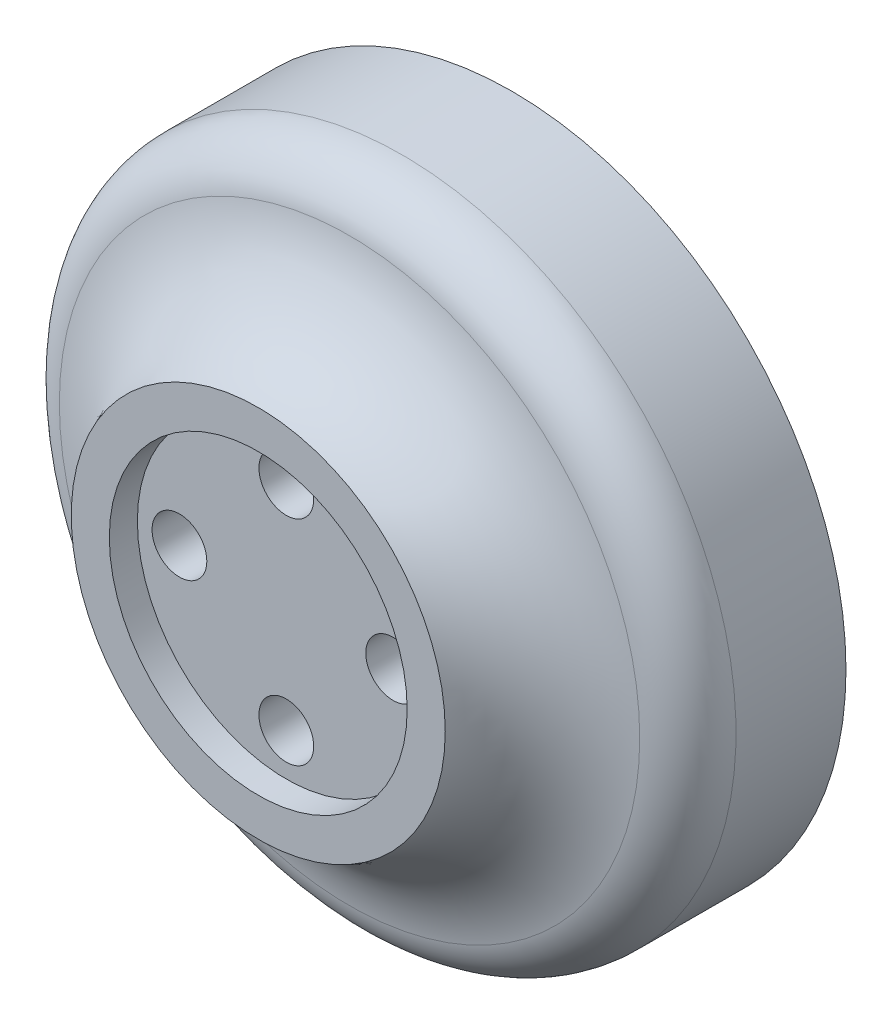
ISO-10303-21;
HEADER;
FILE_DESCRIPTION(('STEP AP214'),'2;1');
FILE_NAME('part.step','',(''),(''),'','','');
FILE_SCHEMA(('AUTOMOTIVE_DESIGN { 1 0 10303 214 1 1 1 1 }'));
ENDSEC;
DATA;
#1=APPLICATION_CONTEXT('core data for automotive mechanical design processes');
#2=APPLICATION_PROTOCOL_DEFINITION('international standard','automotive_design',2000,#1);
#3=PRODUCT_CONTEXT('',#1,'mechanical');
#4=PRODUCT('Part','Part','',(#3));
#5=PRODUCT_RELATED_PRODUCT_CATEGORY('part','',(#4));
#6=PRODUCT_DEFINITION_FORMATION('','',#4);
#7=PRODUCT_DEFINITION_CONTEXT('part definition',#1,'design');
#8=PRODUCT_DEFINITION('design','',#6,#7);
#9=PRODUCT_DEFINITION_SHAPE('','',#8);
#10=(LENGTH_UNIT() NAMED_UNIT(*) SI_UNIT(.MILLI.,.METRE.));
#11=(NAMED_UNIT(*) PLANE_ANGLE_UNIT() SI_UNIT($,.RADIAN.));
#12=(NAMED_UNIT(*) SI_UNIT($,.STERADIAN.) SOLID_ANGLE_UNIT());
#13=UNCERTAINTY_MEASURE_WITH_UNIT(LENGTH_MEASURE(1.E-05),#10,'distance_accuracy_value','');
#14=(GEOMETRIC_REPRESENTATION_CONTEXT(3) GLOBAL_UNCERTAINTY_ASSIGNED_CONTEXT((#13)) GLOBAL_UNIT_ASSIGNED_CONTEXT((#10,
#11,#12)) REPRESENTATION_CONTEXT('',''));
#15=CARTESIAN_POINT('',(0.,0.,0.));
#16=DIRECTION('',(0.,0.,1.));
#17=DIRECTION('',(1.,0.,0.));
#18=AXIS2_PLACEMENT_3D('',#15,#16,#17);
#19=CARTESIAN_POINT('',(0.,0.,12.));
#20=DIRECTION('',(0.,0.,-1.));
#21=DIRECTION('',(-1.,0.,0.));
#22=AXIS2_PLACEMENT_3D('',#19,#20,#21);
#23=CYLINDRICAL_SURFACE('',#22,25.);
#24=CARTESIAN_POINT('',(0.,0.,8.23223009349835));
#25=DIRECTION('',(0.,0.,-1.));
#26=DIRECTION('',(-1.,0.,0.));
#27=AXIS2_PLACEMENT_3D('',#24,#25,#26);
#28=CIRCLE('',#27,25.);
#29=CARTESIAN_POINT('',(-25.,0.,8.23223009349835));
#30=VERTEX_POINT('',#29);
#31=EDGE_CURVE('E10',#30,#30,#28,.T.);
#32=ORIENTED_EDGE('',*,*,#31,.T.);
#33=EDGE_LOOP('',(#32));
#34=FACE_BOUND('',#33,.T.);
#35=CARTESIAN_POINT('',(0.,0.,0.));
#36=DIRECTION('',(0.,0.,1.));
#37=DIRECTION('',(1.,0.,0.));
#38=AXIS2_PLACEMENT_3D('',#35,#36,#37);
#39=CIRCLE('',#38,25.);
#40=CARTESIAN_POINT('',(25.,0.,0.));
#41=VERTEX_POINT('',#40);
#42=EDGE_CURVE('E53',#41,#41,#39,.T.);
#43=ORIENTED_EDGE('',*,*,#42,.T.);
#44=EDGE_LOOP('',(#43));
#45=FACE_BOUND('',#44,.T.);
#46=ADVANCED_FACE('F40',(#34,#45),#23,.T.);
#47=CARTESIAN_POINT('',(0.,0.,0.));
#48=DIRECTION('',(0.,0.,1.));
#49=DIRECTION('',(1.,0.,0.));
#50=AXIS2_PLACEMENT_3D('',#47,#48,#49);
#51=PLANE('',#50);
#52=CARTESIAN_POINT('',(0.,18.,0.));
#53=DIRECTION('',(0.,0.,1.));
#54=DIRECTION('',(1.,0.,0.));
#55=AXIS2_PLACEMENT_3D('',#52,#53,#54);
#56=CIRCLE('',#55,2.05);
#57=CARTESIAN_POINT('',(2.05,18.,0.));
#58=VERTEX_POINT('',#57);
#59=EDGE_CURVE('E137',#58,#58,#56,.T.);
#60=ORIENTED_EDGE('',*,*,#59,.T.);
#61=EDGE_LOOP('',(#60));
#62=FACE_BOUND('',#61,.T.);
#63=CARTESIAN_POINT('',(18.,0.,0.));
#64=DIRECTION('',(0.,0.,1.));
#65=DIRECTION('',(1.,0.,0.));
#66=AXIS2_PLACEMENT_3D('',#63,#64,#65);
#67=CIRCLE('',#66,2.05);
#68=CARTESIAN_POINT('',(20.05,0.,0.));
#69=VERTEX_POINT('',#68);
#70=EDGE_CURVE('E133',#69,#69,#67,.T.);
#71=ORIENTED_EDGE('',*,*,#70,.T.);
#72=EDGE_LOOP('',(#71));
#73=FACE_BOUND('',#72,.T.);
#74=CARTESIAN_POINT('',(0.,-18.,0.));
#75=DIRECTION('',(0.,0.,1.));
#76=DIRECTION('',(1.,0.,0.));
#77=AXIS2_PLACEMENT_3D('',#74,#75,#76);
#78=CIRCLE('',#77,2.05);
#79=CARTESIAN_POINT('',(2.05,-18.,0.));
#80=VERTEX_POINT('',#79);
#81=EDGE_CURVE('E125',#80,#80,#78,.T.);
#82=ORIENTED_EDGE('',*,*,#81,.T.);
#83=EDGE_LOOP('',(#82));
#84=FACE_BOUND('',#83,.T.);
#85=CARTESIAN_POINT('',(-18.,0.,0.));
#86=DIRECTION('',(0.,0.,1.));
#87=DIRECTION('',(1.,0.,0.));
#88=AXIS2_PLACEMENT_3D('',#85,#86,#87);
#89=CIRCLE('',#88,2.05);
#90=CARTESIAN_POINT('',(-15.95,0.,0.));
#91=VERTEX_POINT('',#90);
#92=EDGE_CURVE('E117',#91,#91,#89,.T.);
#93=ORIENTED_EDGE('',*,*,#92,.T.);
#94=EDGE_LOOP('',(#93));
#95=FACE_BOUND('',#94,.T.);
#96=CARTESIAN_POINT('',(0.,0.,0.));
#97=DIRECTION('',(0.,0.,1.));
#98=DIRECTION('',(1.,0.,0.));
#99=AXIS2_PLACEMENT_3D('',#96,#97,#98);
#100=CIRCLE('',#99,11.);
#101=CARTESIAN_POINT('',(11.,0.,0.));
#102=VERTEX_POINT('',#101);
#103=EDGE_CURVE('E73',#102,#102,#100,.T.);
#104=ORIENTED_EDGE('',*,*,#103,.T.);
#105=EDGE_LOOP('',(#104));
#106=FACE_BOUND('',#105,.T.);
#107=ORIENTED_EDGE('',*,*,#42,.F.);
#108=EDGE_LOOP('',(#107));
#109=FACE_BOUND('',#108,.T.);
#110=ADVANCED_FACE('F157',(#62,#73,#84,#95,#106,#109),#51,.F.);
#111=CARTESIAN_POINT('',(0.,0.,19.));
#112=DIRECTION('',(0.,0.,1.));
#113=DIRECTION('',(1.,0.,0.));
#114=AXIS2_PLACEMENT_3D('',#111,#112,#113);
#115=PLANE('',#114);
#116=CARTESIAN_POINT('',(0.,0.,19.));
#117=DIRECTION('',(0.,0.,1.));
#118=DIRECTION('',(1.,0.,0.));
#119=AXIS2_PLACEMENT_3D('',#116,#117,#118);
#120=CIRCLE('',#119,11.15);
#121=CARTESIAN_POINT('',(11.15,0.,19.));
#122=VERTEX_POINT('',#121);
#123=EDGE_CURVE('E65',#122,#122,#120,.T.);
#124=ORIENTED_EDGE('',*,*,#123,.F.);
#125=EDGE_LOOP('',(#124));
#126=FACE_BOUND('',#125,.T.);
#127=CARTESIAN_POINT('',(0.,0.,19.));
#128=DIRECTION('',(0.,0.,1.));
#129=DIRECTION('',(1.,0.,0.));
#130=AXIS2_PLACEMENT_3D('',#127,#128,#129);
#131=CIRCLE('',#130,14.);
#132=CARTESIAN_POINT('',(14.,0.,19.));
#133=VERTEX_POINT('',#132);
#134=EDGE_CURVE('E58',#133,#133,#131,.T.);
#135=ORIENTED_EDGE('',*,*,#134,.T.);
#136=EDGE_LOOP('',(#135));
#137=FACE_BOUND('',#136,.T.);
#138=ADVANCED_FACE('F162',(#126,#137),#115,.T.);
#139=CARTESIAN_POINT('',(0.,0.,16.9));
#140=DIRECTION('',(0.,0.,1.));
#141=DIRECTION('',(1.,0.,0.));
#142=AXIS2_PLACEMENT_3D('',#139,#140,#141);
#143=CYLINDRICAL_SURFACE('',#142,11.15);
#144=CARTESIAN_POINT('',(0.,0.,16.9));
#145=DIRECTION('',(0.,0.,1.));
#146=DIRECTION('',(1.,0.,0.));
#147=AXIS2_PLACEMENT_3D('',#144,#145,#146);
#148=CIRCLE('',#147,11.15);
#149=CARTESIAN_POINT('',(11.15,0.,16.9));
#150=VERTEX_POINT('',#149);
#151=EDGE_CURVE('E64',#150,#150,#148,.T.);
#152=ORIENTED_EDGE('',*,*,#151,.F.);
#153=EDGE_LOOP('',(#152));
#154=FACE_BOUND('',#153,.T.);
#155=ORIENTED_EDGE('',*,*,#123,.T.);
#156=EDGE_LOOP('',(#155));
#157=FACE_BOUND('',#156,.T.);
#158=ADVANCED_FACE('F176',(#154,#157),#143,.F.);
#159=CARTESIAN_POINT('',(0.,0.,16.9));
#160=DIRECTION('',(0.,0.,1.));
#161=DIRECTION('',(1.,0.,0.));
#162=AXIS2_PLACEMENT_3D('',#159,#160,#161);
#163=PLANE('',#162);
#164=CARTESIAN_POINT('',(0.,8.,16.9));
#165=DIRECTION('',(0.,0.,1.));
#166=DIRECTION('',(1.,0.,0.));
#167=AXIS2_PLACEMENT_3D('',#164,#165,#166);
#168=CIRCLE('',#167,2.05);
#169=CARTESIAN_POINT('',(2.05,8.,16.9));
#170=VERTEX_POINT('',#169);
#171=EDGE_CURVE('E106',#170,#170,#168,.T.);
#172=ORIENTED_EDGE('',*,*,#171,.F.);
#173=EDGE_LOOP('',(#172));
#174=FACE_BOUND('',#173,.T.);
#175=CARTESIAN_POINT('',(8.,0.,16.9));
#176=DIRECTION('',(0.,0.,1.));
#177=DIRECTION('',(1.,0.,0.));
#178=AXIS2_PLACEMENT_3D('',#175,#176,#177);
#179=CIRCLE('',#178,2.05);
#180=CARTESIAN_POINT('',(10.05,0.,16.9));
#181=VERTEX_POINT('',#180);
#182=EDGE_CURVE('E102',#181,#181,#179,.T.);
#183=ORIENTED_EDGE('',*,*,#182,.F.);
#184=EDGE_LOOP('',(#183));
#185=FACE_BOUND('',#184,.T.);
#186=CARTESIAN_POINT('',(0.,-8.,16.9));
#187=DIRECTION('',(0.,0.,1.));
#188=DIRECTION('',(1.,0.,0.));
#189=AXIS2_PLACEMENT_3D('',#186,#187,#188);
#190=CIRCLE('',#189,2.05);
#191=CARTESIAN_POINT('',(2.05,-8.,16.9));
#192=VERTEX_POINT('',#191);
#193=EDGE_CURVE('E94',#192,#192,#190,.T.);
#194=ORIENTED_EDGE('',*,*,#193,.F.);
#195=EDGE_LOOP('',(#194));
#196=FACE_BOUND('',#195,.T.);
#197=CARTESIAN_POINT('',(-8.,0.,16.9));
#198=DIRECTION('',(0.,0.,1.));
#199=DIRECTION('',(1.,0.,0.));
#200=AXIS2_PLACEMENT_3D('',#197,#198,#199);
#201=CIRCLE('',#200,2.05);
#202=CARTESIAN_POINT('',(-5.95,0.,16.9));
#203=VERTEX_POINT('',#202);
#204=EDGE_CURVE('E85',#203,#203,#201,.T.);
#205=ORIENTED_EDGE('',*,*,#204,.F.);
#206=EDGE_LOOP('',(#205));
#207=FACE_BOUND('',#206,.T.);
#208=ORIENTED_EDGE('',*,*,#151,.T.);
#209=EDGE_LOOP('',(#208));
#210=FACE_BOUND('',#209,.T.);
#211=ADVANCED_FACE('F169',(#174,#185,#196,#207,#210),#163,.T.);
#212=CARTESIAN_POINT('',(0.,0.,22.));
#213=DIRECTION('',(0.,0.,1.));
#214=DIRECTION('',(1.,0.,0.));
#215=AXIS2_PLACEMENT_3D('',#212,#213,#214);
#216=TOROIDAL_SURFACE('',#215,23.5393920141695,10.);
#217=CARTESIAN_POINT('',(0.,0.,12.1658786382131));
#218=DIRECTION('',(0.,0.,1.));
#219=DIRECTION('',(1.,0.,0.));
#220=AXIS2_PLACEMENT_3D('',#217,#218,#219);
#221=CIRCLE('',#220,21.725540575477);
#222=CARTESIAN_POINT('',(21.725540575477,0.,12.1658786382131));
#223=VERTEX_POINT('',#222);
#224=EDGE_CURVE('E48',#223,#223,#221,.T.);
#225=ORIENTED_EDGE('',*,*,#224,.T.);
#226=EDGE_LOOP('',(#225));
#227=FACE_BOUND('',#226,.T.);
#228=ORIENTED_EDGE('',*,*,#134,.F.);
#229=EDGE_LOOP('',(#228));
#230=FACE_BOUND('',#229,.T.);
#231=ADVANCED_FACE('F167',(#227,#230),#216,.F.);
#232=CARTESIAN_POINT('',(0.,0.,8.23223009349835));
#233=DIRECTION('',(0.,0.,-1.));
#234=DIRECTION('',(-1.,0.,0.));
#235=AXIS2_PLACEMENT_3D('',#232,#233,#234);
#236=TOROIDAL_SURFACE('',#235,21.,4.);
#237=ORIENTED_EDGE('',*,*,#31,.F.);
#238=EDGE_LOOP('',(#237));
#239=FACE_BOUND('',#238,.T.);
#240=ORIENTED_EDGE('',*,*,#224,.F.);
#241=EDGE_LOOP('',(#240));
#242=FACE_BOUND('',#241,.T.);
#243=ADVANCED_FACE('F42',(#239,#242),#236,.T.);
#244=CARTESIAN_POINT('',(0.,0.,-8.));
#245=DIRECTION('',(0.,0.,1.));
#246=DIRECTION('',(1.,0.,0.));
#247=AXIS2_PLACEMENT_3D('',#244,#245,#246);
#248=CYLINDRICAL_SURFACE('',#247,11.);
#249=CARTESIAN_POINT('',(0.,0.,-8.));
#250=DIRECTION('',(0.,0.,1.));
#251=DIRECTION('',(1.,0.,0.));
#252=AXIS2_PLACEMENT_3D('',#249,#250,#251);
#253=CIRCLE('',#252,11.);
#254=CARTESIAN_POINT('',(11.,0.,-8.));
#255=VERTEX_POINT('',#254);
#256=EDGE_CURVE('E69',#255,#255,#253,.T.);
#257=ORIENTED_EDGE('',*,*,#256,.T.);
#258=EDGE_LOOP('',(#257));
#259=FACE_BOUND('',#258,.T.);
#260=ORIENTED_EDGE('',*,*,#103,.F.);
#261=EDGE_LOOP('',(#260));
#262=FACE_BOUND('',#261,.T.);
#263=ADVANCED_FACE('F174',(#259,#262),#248,.T.);
#264=CARTESIAN_POINT('',(0.,0.,-8.));
#265=DIRECTION('',(0.,0.,1.));
#266=DIRECTION('',(1.,0.,0.));
#267=AXIS2_PLACEMENT_3D('',#264,#265,#266);
#268=PLANE('',#267);
#269=ORIENTED_EDGE('',*,*,#256,.F.);
#270=EDGE_LOOP('',(#269));
#271=FACE_BOUND('',#270,.T.);
#272=ADVANCED_FACE('F193',(#271),#268,.F.);
#273=CARTESIAN_POINT('',(-8.,0.,7.9));
#274=DIRECTION('',(0.,0.,1.));
#275=DIRECTION('',(1.,0.,0.));
#276=AXIS2_PLACEMENT_3D('',#273,#274,#275);
#277=CYLINDRICAL_SURFACE('',#276,2.05);
#278=CARTESIAN_POINT('',(-8.,0.,7.9));
#279=DIRECTION('',(0.,0.,1.));
#280=DIRECTION('',(1.,0.,0.));
#281=AXIS2_PLACEMENT_3D('',#278,#279,#280);
#282=CIRCLE('',#281,2.05);
#283=CARTESIAN_POINT('',(-5.95,0.,7.9));
#284=VERTEX_POINT('',#283);
#285=EDGE_CURVE('E81',#284,#284,#282,.T.);
#286=ORIENTED_EDGE('',*,*,#285,.F.);
#287=EDGE_LOOP('',(#286));
#288=FACE_BOUND('',#287,.T.);
#289=ORIENTED_EDGE('',*,*,#204,.T.);
#290=EDGE_LOOP('',(#289));
#291=FACE_BOUND('',#290,.T.);
#292=ADVANCED_FACE('F197',(#288,#291),#277,.F.);
#293=CARTESIAN_POINT('',(-8.,0.,7.9));
#294=DIRECTION('',(0.,0.,1.));
#295=DIRECTION('',(1.,0.,0.));
#296=AXIS2_PLACEMENT_3D('',#293,#294,#295);
#297=PLANE('',#296);
#298=ORIENTED_EDGE('',*,*,#285,.T.);
#299=EDGE_LOOP('',(#298));
#300=FACE_BOUND('',#299,.T.);
#301=ADVANCED_FACE('F199',(#300),#297,.T.);
#302=CARTESIAN_POINT('',(0.,-8.,7.9));
#303=DIRECTION('',(0.,0.,1.));
#304=DIRECTION('',(1.,0.,0.));
#305=AXIS2_PLACEMENT_3D('',#302,#303,#304);
#306=CYLINDRICAL_SURFACE('',#305,2.05);
#307=CARTESIAN_POINT('',(0.,-8.,7.9));
#308=DIRECTION('',(0.,0.,1.));
#309=DIRECTION('',(1.,0.,0.));
#310=AXIS2_PLACEMENT_3D('',#307,#308,#309);
#311=CIRCLE('',#310,2.05);
#312=CARTESIAN_POINT('',(2.05,-8.,7.9));
#313=VERTEX_POINT('',#312);
#314=EDGE_CURVE('E90',#313,#313,#311,.T.);
#315=ORIENTED_EDGE('',*,*,#314,.F.);
#316=EDGE_LOOP('',(#315));
#317=FACE_BOUND('',#316,.T.);
#318=ORIENTED_EDGE('',*,*,#193,.T.);
#319=EDGE_LOOP('',(#318));
#320=FACE_BOUND('',#319,.T.);
#321=ADVANCED_FACE('F202',(#317,#320),#306,.F.);
#322=CARTESIAN_POINT('',(0.,-8.,7.9));
#323=DIRECTION('',(0.,0.,1.));
#324=DIRECTION('',(1.,0.,0.));
#325=AXIS2_PLACEMENT_3D('',#322,#323,#324);
#326=PLANE('',#325);
#327=ORIENTED_EDGE('',*,*,#314,.T.);
#328=EDGE_LOOP('',(#327));
#329=FACE_BOUND('',#328,.T.);
#330=ADVANCED_FACE('F207',(#329),#326,.T.);
#331=CARTESIAN_POINT('',(8.,0.,7.9));
#332=DIRECTION('',(0.,0.,1.));
#333=DIRECTION('',(1.,0.,0.));
#334=AXIS2_PLACEMENT_3D('',#331,#332,#333);
#335=CYLINDRICAL_SURFACE('',#334,2.05);
#336=CARTESIAN_POINT('',(8.,0.,7.9));
#337=DIRECTION('',(0.,0.,1.));
#338=DIRECTION('',(1.,0.,0.));
#339=AXIS2_PLACEMENT_3D('',#336,#337,#338);
#340=CIRCLE('',#339,2.05);
#341=CARTESIAN_POINT('',(10.05,0.,7.9));
#342=VERTEX_POINT('',#341);
#343=EDGE_CURVE('E98',#342,#342,#340,.T.);
#344=ORIENTED_EDGE('',*,*,#343,.F.);
#345=EDGE_LOOP('',(#344));
#346=FACE_BOUND('',#345,.T.);
#347=ORIENTED_EDGE('',*,*,#182,.T.);
#348=EDGE_LOOP('',(#347));
#349=FACE_BOUND('',#348,.T.);
#350=ADVANCED_FACE('F210',(#346,#349),#335,.F.);
#351=CARTESIAN_POINT('',(8.,0.,7.9));
#352=DIRECTION('',(0.,0.,1.));
#353=DIRECTION('',(1.,0.,0.));
#354=AXIS2_PLACEMENT_3D('',#351,#352,#353);
#355=PLANE('',#354);
#356=ORIENTED_EDGE('',*,*,#343,.T.);
#357=EDGE_LOOP('',(#356));
#358=FACE_BOUND('',#357,.T.);
#359=ADVANCED_FACE('F215',(#358),#355,.T.);
#360=CARTESIAN_POINT('',(0.,8.,7.9));
#361=DIRECTION('',(0.,0.,1.));
#362=DIRECTION('',(1.,0.,0.));
#363=AXIS2_PLACEMENT_3D('',#360,#361,#362);
#364=CYLINDRICAL_SURFACE('',#363,2.05);
#365=CARTESIAN_POINT('',(0.,8.,7.9));
#366=DIRECTION('',(0.,0.,1.));
#367=DIRECTION('',(1.,0.,0.));
#368=AXIS2_PLACEMENT_3D('',#365,#366,#367);
#369=CIRCLE('',#368,2.05);
#370=CARTESIAN_POINT('',(2.05,8.,7.9));
#371=VERTEX_POINT('',#370);
#372=EDGE_CURVE('E77',#371,#371,#369,.T.);
#373=ORIENTED_EDGE('',*,*,#372,.F.);
#374=EDGE_LOOP('',(#373));
#375=FACE_BOUND('',#374,.T.);
#376=ORIENTED_EDGE('',*,*,#171,.T.);
#377=EDGE_LOOP('',(#376));
#378=FACE_BOUND('',#377,.T.);
#379=ADVANCED_FACE('F218',(#375,#378),#364,.F.);
#380=CARTESIAN_POINT('',(0.,8.,7.9));
#381=DIRECTION('',(0.,0.,1.));
#382=DIRECTION('',(1.,0.,0.));
#383=AXIS2_PLACEMENT_3D('',#380,#381,#382);
#384=PLANE('',#383);
#385=ORIENTED_EDGE('',*,*,#372,.T.);
#386=EDGE_LOOP('',(#385));
#387=FACE_BOUND('',#386,.T.);
#388=ADVANCED_FACE('F225',(#387),#384,.T.);
#389=CARTESIAN_POINT('',(-18.,0.,9.));
#390=DIRECTION('',(0.,0.,-1.));
#391=DIRECTION('',(-1.,0.,0.));
#392=AXIS2_PLACEMENT_3D('',#389,#390,#391);
#393=CYLINDRICAL_SURFACE('',#392,2.05);
#394=CARTESIAN_POINT('',(-18.,0.,9.));
#395=DIRECTION('',(0.,0.,1.));
#396=DIRECTION('',(1.,0.,0.));
#397=AXIS2_PLACEMENT_3D('',#394,#395,#396);
#398=CIRCLE('',#397,2.05);
#399=CARTESIAN_POINT('',(-15.95,0.,9.));
#400=VERTEX_POINT('',#399);
#401=EDGE_CURVE('E113',#400,#400,#398,.T.);
#402=ORIENTED_EDGE('',*,*,#401,.T.);
#403=EDGE_LOOP('',(#402));
#404=FACE_BOUND('',#403,.T.);
#405=ORIENTED_EDGE('',*,*,#92,.F.);
#406=EDGE_LOOP('',(#405));
#407=FACE_BOUND('',#406,.T.);
#408=ADVANCED_FACE('F229',(#404,#407),#393,.F.);
#409=CARTESIAN_POINT('',(-18.,0.,9.));
#410=DIRECTION('',(0.,0.,1.));
#411=DIRECTION('',(1.,0.,0.));
#412=AXIS2_PLACEMENT_3D('',#409,#410,#411);
#413=PLANE('',#412);
#414=ORIENTED_EDGE('',*,*,#401,.F.);
#415=EDGE_LOOP('',(#414));
#416=FACE_BOUND('',#415,.T.);
#417=ADVANCED_FACE('F231',(#416),#413,.F.);
#418=CARTESIAN_POINT('',(0.,-18.,9.));
#419=DIRECTION('',(0.,0.,-1.));
#420=DIRECTION('',(-1.,0.,0.));
#421=AXIS2_PLACEMENT_3D('',#418,#419,#420);
#422=CYLINDRICAL_SURFACE('',#421,2.05);
#423=CARTESIAN_POINT('',(0.,-18.,9.));
#424=DIRECTION('',(0.,0.,1.));
#425=DIRECTION('',(1.,0.,0.));
#426=AXIS2_PLACEMENT_3D('',#423,#424,#425);
#427=CIRCLE('',#426,2.05);
#428=CARTESIAN_POINT('',(2.05,-18.,9.));
#429=VERTEX_POINT('',#428);
#430=EDGE_CURVE('E121',#429,#429,#427,.T.);
#431=ORIENTED_EDGE('',*,*,#430,.T.);
#432=EDGE_LOOP('',(#431));
#433=FACE_BOUND('',#432,.T.);
#434=ORIENTED_EDGE('',*,*,#81,.F.);
#435=EDGE_LOOP('',(#434));
#436=FACE_BOUND('',#435,.T.);
#437=ADVANCED_FACE('F234',(#433,#436),#422,.F.);
#438=CARTESIAN_POINT('',(0.,-18.,9.));
#439=DIRECTION('',(0.,0.,1.));
#440=DIRECTION('',(1.,0.,0.));
#441=AXIS2_PLACEMENT_3D('',#438,#439,#440);
#442=PLANE('',#441);
#443=ORIENTED_EDGE('',*,*,#430,.F.);
#444=EDGE_LOOP('',(#443));
#445=FACE_BOUND('',#444,.T.);
#446=ADVANCED_FACE('F239',(#445),#442,.F.);
#447=CARTESIAN_POINT('',(18.,0.,9.));
#448=DIRECTION('',(0.,0.,-1.));
#449=DIRECTION('',(-1.,0.,0.));
#450=AXIS2_PLACEMENT_3D('',#447,#448,#449);
#451=CYLINDRICAL_SURFACE('',#450,2.05);
#452=CARTESIAN_POINT('',(18.,0.,9.));
#453=DIRECTION('',(0.,0.,1.));
#454=DIRECTION('',(1.,0.,0.));
#455=AXIS2_PLACEMENT_3D('',#452,#453,#454);
#456=CIRCLE('',#455,2.05);
#457=CARTESIAN_POINT('',(20.05,0.,9.));
#458=VERTEX_POINT('',#457);
#459=EDGE_CURVE('E129',#458,#458,#456,.T.);
#460=ORIENTED_EDGE('',*,*,#459,.T.);
#461=EDGE_LOOP('',(#460));
#462=FACE_BOUND('',#461,.T.);
#463=ORIENTED_EDGE('',*,*,#70,.F.);
#464=EDGE_LOOP('',(#463));
#465=FACE_BOUND('',#464,.T.);
#466=ADVANCED_FACE('F242',(#462,#465),#451,.F.);
#467=CARTESIAN_POINT('',(18.,0.,9.));
#468=DIRECTION('',(0.,0.,1.));
#469=DIRECTION('',(1.,0.,0.));
#470=AXIS2_PLACEMENT_3D('',#467,#468,#469);
#471=PLANE('',#470);
#472=ORIENTED_EDGE('',*,*,#459,.F.);
#473=EDGE_LOOP('',(#472));
#474=FACE_BOUND('',#473,.T.);
#475=ADVANCED_FACE('F154',(#474),#471,.F.);
#476=CARTESIAN_POINT('',(0.,18.,9.));
#477=DIRECTION('',(0.,0.,-1.));
#478=DIRECTION('',(-1.,0.,0.));
#479=AXIS2_PLACEMENT_3D('',#476,#477,#478);
#480=CYLINDRICAL_SURFACE('',#479,2.05);
#481=CARTESIAN_POINT('',(0.,18.,9.));
#482=DIRECTION('',(0.,0.,1.));
#483=DIRECTION('',(1.,0.,0.));
#484=AXIS2_PLACEMENT_3D('',#481,#482,#483);
#485=CIRCLE('',#484,2.05);
#486=CARTESIAN_POINT('',(2.05,18.,9.));
#487=VERTEX_POINT('',#486);
#488=EDGE_CURVE('E86',#487,#487,#485,.T.);
#489=ORIENTED_EDGE('',*,*,#488,.T.);
#490=EDGE_LOOP('',(#489));
#491=FACE_BOUND('',#490,.T.);
#492=ORIENTED_EDGE('',*,*,#59,.F.);
#493=EDGE_LOOP('',(#492));
#494=FACE_BOUND('',#493,.T.);
#495=ADVANCED_FACE('F145',(#491,#494),#480,.F.);
#496=CARTESIAN_POINT('',(0.,18.,9.));
#497=DIRECTION('',(0.,0.,1.));
#498=DIRECTION('',(1.,0.,0.));
#499=AXIS2_PLACEMENT_3D('',#496,#497,#498);
#500=PLANE('',#499);
#501=ORIENTED_EDGE('',*,*,#488,.F.);
#502=EDGE_LOOP('',(#501));
#503=FACE_BOUND('',#502,.T.);
#504=ADVANCED_FACE('F148',(#503),#500,.F.);
#505=CLOSED_SHELL('',(#46,#110,#138,#158,#211,#231,#243,#263,#272,#292,#301,#321,#330,#350,#359,
#379,#388,#408,#417,#437,#446,#466,#475,#495,#504));
#506=MANIFOLD_SOLID_BREP('B2',#505);
#507=ADVANCED_BREP_SHAPE_REPRESENTATION('',(#18,#506),#14);
#508=SHAPE_DEFINITION_REPRESENTATION(#9,#507);
ENDSEC;
END-ISO-10303-21;
